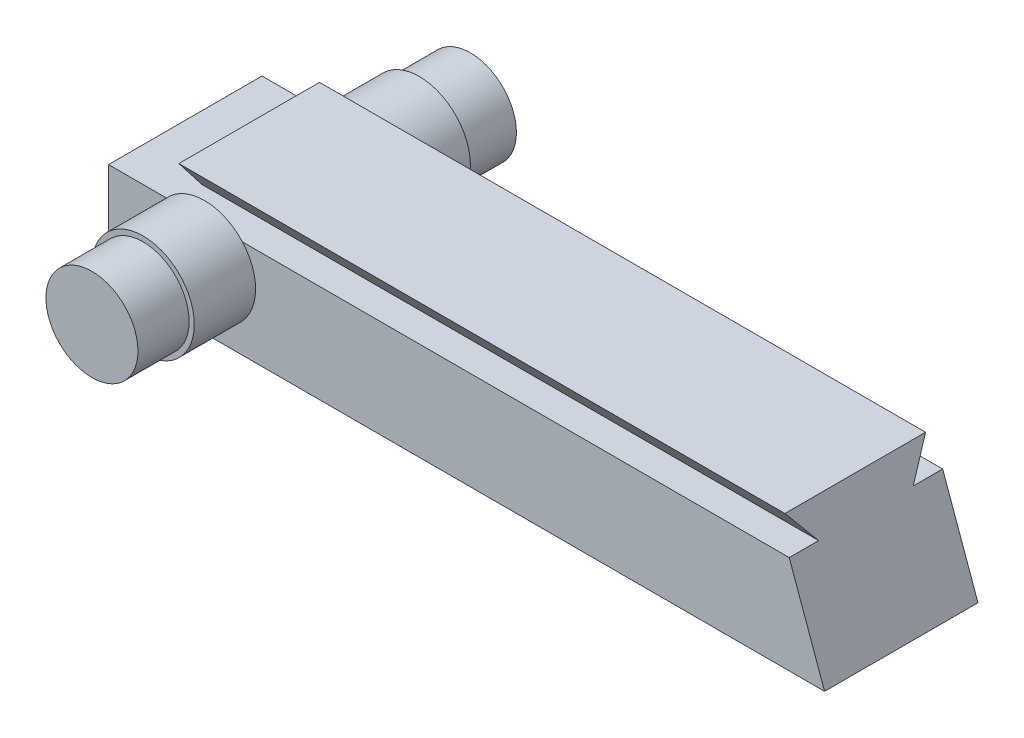
ISO-10303-21;
HEADER;
FILE_DESCRIPTION(('STEP AP214'),'2;1');
FILE_NAME('part.step','',(''),(''),'','','');
FILE_SCHEMA(('AUTOMOTIVE_DESIGN { 1 0 10303 214 1 1 1 1 }'));
ENDSEC;
DATA;
#1=APPLICATION_CONTEXT('core data for automotive mechanical design processes');
#2=APPLICATION_PROTOCOL_DEFINITION('international standard','automotive_design',2000,#1);
#3=PRODUCT_CONTEXT('',#1,'mechanical');
#4=PRODUCT('Part','Part','',(#3));
#5=PRODUCT_RELATED_PRODUCT_CATEGORY('part','',(#4));
#6=PRODUCT_DEFINITION_FORMATION('','',#4);
#7=PRODUCT_DEFINITION_CONTEXT('part definition',#1,'design');
#8=PRODUCT_DEFINITION('design','',#6,#7);
#9=PRODUCT_DEFINITION_SHAPE('','',#8);
#10=(LENGTH_UNIT() NAMED_UNIT(*) SI_UNIT(.MILLI.,.METRE.));
#11=(NAMED_UNIT(*) PLANE_ANGLE_UNIT() SI_UNIT($,.RADIAN.));
#12=(NAMED_UNIT(*) SI_UNIT($,.STERADIAN.) SOLID_ANGLE_UNIT());
#13=UNCERTAINTY_MEASURE_WITH_UNIT(LENGTH_MEASURE(1.E-05),#10,'distance_accuracy_value','');
#14=(GEOMETRIC_REPRESENTATION_CONTEXT(3) GLOBAL_UNCERTAINTY_ASSIGNED_CONTEXT((#13)) GLOBAL_UNIT_ASSIGNED_CONTEXT((#10,
#11,#12)) REPRESENTATION_CONTEXT('',''));
#15=CARTESIAN_POINT('',(0.,0.,0.));
#16=DIRECTION('',(0.,0.,1.));
#17=DIRECTION('',(1.,0.,0.));
#18=AXIS2_PLACEMENT_3D('',#15,#16,#17);
#19=CARTESIAN_POINT('',(-13.0175,0.7366,6.85800000000001));
#20=DIRECTION('',(0.,0.,1.));
#21=DIRECTION('',(1.,0.,0.));
#22=AXIS2_PLACEMENT_3D('',#19,#20,#21);
#23=PLANE('',#22);
#24=CARTESIAN_POINT('',(-13.0175,0.7366,6.85800000000001));
#25=DIRECTION('',(0.,0.,1.));
#26=DIRECTION('',(1.,0.,0.));
#27=AXIS2_PLACEMENT_3D('',#24,#25,#26);
#28=CIRCLE('',#27,2.54);
#29=CARTESIAN_POINT('',(-10.4775,0.7366,6.85800000000001));
#30=VERTEX_POINT('',#29);
#31=EDGE_CURVE('E208',#30,#30,#28,.T.);
#32=ORIENTED_EDGE('',*,*,#31,.T.);
#33=EDGE_LOOP('',(#32));
#34=FACE_BOUND('',#33,.T.);
#35=CARTESIAN_POINT('',(-13.0175,0.7366,6.85800000000001));
#36=DIRECTION('',(0.,0.,1.));
#37=DIRECTION('',(1.,0.,0.));
#38=AXIS2_PLACEMENT_3D('',#35,#36,#37);
#39=CIRCLE('',#38,2.286);
#40=CARTESIAN_POINT('',(-10.7315,0.7366,6.85800000000001));
#41=VERTEX_POINT('',#40);
#42=EDGE_CURVE('E217',#41,#41,#39,.T.);
#43=ORIENTED_EDGE('',*,*,#42,.F.);
#44=EDGE_LOOP('',(#43));
#45=FACE_BOUND('',#44,.T.);
#46=ADVANCED_FACE('F31',(#34,#45),#23,.T.);
#47=CARTESIAN_POINT('',(17.78,-2.4384,3.81000000000001));
#48=DIRECTION('',(0.,0.,-1.));
#49=DIRECTION('',(-1.,0.,0.));
#50=AXIS2_PLACEMENT_3D('',#47,#48,#49);
#51=PLANE('',#50);
#52=CARTESIAN_POINT('',(-13.0175,0.7366,3.81000000000001));
#53=DIRECTION('',(0.,0.,1.));
#54=DIRECTION('',(1.,0.,0.));
#55=AXIS2_PLACEMENT_3D('',#52,#53,#54);
#56=CIRCLE('',#55,2.54);
#57=CARTESIAN_POINT('',(-14.9030971892215,2.4384,3.81000000000001));
#58=VERTEX_POINT('',#57);
#59=CARTESIAN_POINT('',(-11.1319028107785,2.4384,3.81000000000001));
#60=VERTEX_POINT('',#59);
#61=EDGE_CURVE('E53',#58,#60,#56,.T.);
#62=ORIENTED_EDGE('',*,*,#61,.F.);
#63=DIRECTION('',(-1.,0.,0.));
#64=VECTOR('',#63,1.);
#65=CARTESIAN_POINT('',(17.78,2.4384,3.81000000000001));
#66=LINE('',#65,#64);
#67=CARTESIAN_POINT('',(-17.78,2.4384,3.81000000000001));
#68=VERTEX_POINT('',#67);
#69=EDGE_CURVE('E157',#58,#68,#66,.T.);
#70=ORIENTED_EDGE('',*,*,#69,.T.);
#71=DIRECTION('',(0.,-1.,0.));
#72=VECTOR('',#71,1.);
#73=CARTESIAN_POINT('',(-17.78,-2.4384,3.81000000000001));
#74=LINE('',#73,#72);
#75=CARTESIAN_POINT('',(-17.78,-2.4384,3.81000000000001));
#76=VERTEX_POINT('',#75);
#77=EDGE_CURVE('E151',#68,#76,#74,.T.);
#78=ORIENTED_EDGE('',*,*,#77,.T.);
#79=DIRECTION('',(-1.,0.,0.));
#80=VECTOR('',#79,1.);
#81=CARTESIAN_POINT('',(17.78,-2.4384,3.81000000000001));
#82=LINE('',#81,#80);
#83=CARTESIAN_POINT('',(17.78,-2.4384,3.81000000000001));
#84=VERTEX_POINT('',#83);
#85=EDGE_CURVE('E155',#84,#76,#82,.T.);
#86=ORIENTED_EDGE('',*,*,#85,.F.);
#87=DIRECTION('',(0.338719468272742,-0.940887411868727,0.));
#88=VECTOR('',#87,1.);
#89=CARTESIAN_POINT('',(17.78,-2.4384,3.81000000000001));
#90=LINE('',#89,#88);
#91=CARTESIAN_POINT('',(16.024352,2.4384,3.81000000000001));
#92=VERTEX_POINT('',#91);
#93=EDGE_CURVE('E206',#92,#84,#90,.T.);
#94=ORIENTED_EDGE('',*,*,#93,.F.);
#95=EDGE_CURVE('E126',#92,#60,#66,.T.);
#96=ORIENTED_EDGE('',*,*,#95,.T.);
#97=EDGE_LOOP('',(#62,#70,#78,#86,#94,#96));
#98=FACE_BOUND('',#97,.T.);
#99=ADVANCED_FACE('F238',(#98),#51,.F.);
#100=CARTESIAN_POINT('',(17.78,2.4384,3.81000000000001));
#101=DIRECTION('',(0.,-1.,0.));
#102=DIRECTION('',(0.,0.,-1.));
#103=AXIS2_PLACEMENT_3D('',#100,#101,#102);
#104=PLANE('',#103);
#105=ORIENTED_EDGE('',*,*,#95,.F.);
#106=DIRECTION('',(0.,0.,-1.));
#107=VECTOR('',#106,1.);
#108=CARTESIAN_POINT('',(16.024352,2.4384,3.81000000000001));
#109=LINE('',#108,#107);
#110=CARTESIAN_POINT('',(16.024352,2.4384,2.3495));
#111=VERTEX_POINT('',#110);
#112=EDGE_CURVE('E185',#92,#111,#109,.T.);
#113=ORIENTED_EDGE('',*,*,#112,.T.);
#114=DIRECTION('',(1.,0.,0.));
#115=VECTOR('',#114,1.);
#116=CARTESIAN_POINT('',(-14.605,2.4384,2.3495));
#117=LINE('',#116,#115);
#118=CARTESIAN_POINT('',(-14.605,2.4384,2.3495));
#119=VERTEX_POINT('',#118);
#120=EDGE_CURVE('E141',#119,#111,#117,.T.);
#121=ORIENTED_EDGE('',*,*,#120,.F.);
#122=DIRECTION('',(0.,0.,-1.));
#123=VECTOR('',#122,1.);
#124=CARTESIAN_POINT('',(-14.605,2.4384,2.3495));
#125=LINE('',#124,#123);
#126=CARTESIAN_POINT('',(-14.605,2.4384,-2.3495));
#127=VERTEX_POINT('',#126);
#128=EDGE_CURVE('E184',#119,#127,#125,.T.);
#129=ORIENTED_EDGE('',*,*,#128,.T.);
#130=DIRECTION('',(1.,0.,0.));
#131=VECTOR('',#130,1.);
#132=CARTESIAN_POINT('',(-14.605,2.4384,-2.3495));
#133=LINE('',#132,#131);
#134=CARTESIAN_POINT('',(16.024352,2.4384,-2.3495));
#135=VERTEX_POINT('',#134);
#136=EDGE_CURVE('E136',#127,#135,#133,.T.);
#137=ORIENTED_EDGE('',*,*,#136,.T.);
#138=CARTESIAN_POINT('',(16.024352,2.4384,-3.80999999999999));
#139=VERTEX_POINT('',#138);
#140=EDGE_CURVE('E179',#135,#139,#109,.T.);
#141=ORIENTED_EDGE('',*,*,#140,.T.);
#142=DIRECTION('',(-1.,0.,0.));
#143=VECTOR('',#142,1.);
#144=CARTESIAN_POINT('',(17.78,2.4384,-3.80999999999999));
#145=LINE('',#144,#143);
#146=CARTESIAN_POINT('',(-11.1319028107785,2.4384,-3.81000000000001));
#147=VERTEX_POINT('',#146);
#148=EDGE_CURVE('E128',#139,#147,#145,.T.);
#149=ORIENTED_EDGE('',*,*,#148,.T.);
#150=CARTESIAN_POINT('',(-14.9030971892215,2.4384,-3.81000000000001));
#151=VERTEX_POINT('',#150);
#152=EDGE_CURVE('E115',#147,#151,#145,.T.);
#153=ORIENTED_EDGE('',*,*,#152,.T.);
#154=CARTESIAN_POINT('',(-17.78,2.4384,-3.80999999999999));
#155=VERTEX_POINT('',#154);
#156=EDGE_CURVE('E119',#151,#155,#145,.T.);
#157=ORIENTED_EDGE('',*,*,#156,.T.);
#158=DIRECTION('',(0.,0.,1.));
#159=VECTOR('',#158,1.);
#160=CARTESIAN_POINT('',(-17.78,2.4384,3.81000000000001));
#161=LINE('',#160,#159);
#162=EDGE_CURVE('E148',#155,#68,#161,.T.);
#163=ORIENTED_EDGE('',*,*,#162,.T.);
#164=ORIENTED_EDGE('',*,*,#69,.F.);
#165=EDGE_CURVE('E163',#60,#58,#66,.T.);
#166=ORIENTED_EDGE('',*,*,#165,.F.);
#167=EDGE_LOOP('',(#105,#113,#121,#129,#137,#141,#149,#153,#157,#163,#164,#166));
#168=FACE_BOUND('',#167,.T.);
#169=ADVANCED_FACE('F130',(#168),#104,.F.);
#170=CARTESIAN_POINT('',(17.78,-2.4384,-3.80999999999999));
#171=DIRECTION('',(0.,0.,1.));
#172=DIRECTION('',(1.,0.,0.));
#173=AXIS2_PLACEMENT_3D('',#170,#171,#172);
#174=PLANE('',#173);
#175=ORIENTED_EDGE('',*,*,#156,.F.);
#176=CARTESIAN_POINT('',(-13.0175,0.7366,-3.81000000000001));
#177=DIRECTION('',(0.,0.,1.));
#178=DIRECTION('',(1.,0.,0.));
#179=AXIS2_PLACEMENT_3D('',#176,#177,#178);
#180=CIRCLE('',#179,2.54);
#181=EDGE_CURVE('E39',#151,#147,#180,.T.);
#182=ORIENTED_EDGE('',*,*,#181,.T.);
#183=ORIENTED_EDGE('',*,*,#148,.F.);
#184=DIRECTION('',(0.338719468272742,-0.940887411868727,0.));
#185=VECTOR('',#184,1.);
#186=CARTESIAN_POINT('',(17.78,-2.4384,-3.80999999999999));
#187=LINE('',#186,#185);
#188=CARTESIAN_POINT('',(17.78,-2.4384,-3.81000249999999));
#189=VERTEX_POINT('',#188);
#190=EDGE_CURVE('E175',#139,#189,#187,.T.);
#191=ORIENTED_EDGE('',*,*,#190,.T.);
#192=DIRECTION('',(-1.,0.,0.));
#193=VECTOR('',#192,1.);
#194=CARTESIAN_POINT('',(17.78,-2.4384,-3.80999999999999));
#195=LINE('',#194,#193);
#196=CARTESIAN_POINT('',(-17.78,-2.4384,-3.80999999999999));
#197=VERTEX_POINT('',#196);
#198=EDGE_CURVE('E158',#189,#197,#195,.T.);
#199=ORIENTED_EDGE('',*,*,#198,.T.);
#200=DIRECTION('',(0.,1.,0.));
#201=VECTOR('',#200,1.);
#202=CARTESIAN_POINT('',(-17.78,-2.4384,-3.80999999999999));
#203=LINE('',#202,#201);
#204=EDGE_CURVE('E122',#197,#155,#203,.T.);
#205=ORIENTED_EDGE('',*,*,#204,.T.);
#206=EDGE_LOOP('',(#175,#182,#183,#191,#199,#205));
#207=FACE_BOUND('',#206,.T.);
#208=ADVANCED_FACE('F33',(#207),#174,.F.);
#209=CARTESIAN_POINT('',(17.78,-2.4384,3.81000000000001));
#210=DIRECTION('',(0.,1.,0.));
#211=DIRECTION('',(0.,0.,1.));
#212=AXIS2_PLACEMENT_3D('',#209,#210,#211);
#213=PLANE('',#212);
#214=DIRECTION('',(0.,0.,-1.));
#215=VECTOR('',#214,1.);
#216=CARTESIAN_POINT('',(-17.78,-2.4384,3.81000000000001));
#217=LINE('',#216,#215);
#218=EDGE_CURVE('E153',#76,#197,#217,.T.);
#219=ORIENTED_EDGE('',*,*,#218,.T.);
#220=ORIENTED_EDGE('',*,*,#198,.F.);
#221=DIRECTION('',(0.,0.,-1.));
#222=VECTOR('',#221,1.);
#223=CARTESIAN_POINT('',(17.78,-2.4384,3.81000000000001));
#224=LINE('',#223,#222);
#225=EDGE_CURVE('E154',#84,#189,#224,.T.);
#226=ORIENTED_EDGE('',*,*,#225,.F.);
#227=ORIENTED_EDGE('',*,*,#85,.T.);
#228=EDGE_LOOP('',(#219,#220,#226,#227));
#229=FACE_BOUND('',#228,.T.);
#230=ADVANCED_FACE('F276',(#229),#213,.F.);
#231=CARTESIAN_POINT('',(-17.78,2.4384,-3.80999999999999));
#232=DIRECTION('',(-1.,0.,0.));
#233=DIRECTION('',(0.,0.,1.));
#234=AXIS2_PLACEMENT_3D('',#231,#232,#233);
#235=PLANE('',#234);
#236=ORIENTED_EDGE('',*,*,#204,.F.);
#237=ORIENTED_EDGE('',*,*,#218,.F.);
#238=ORIENTED_EDGE('',*,*,#77,.F.);
#239=ORIENTED_EDGE('',*,*,#162,.F.);
#240=EDGE_LOOP('',(#236,#237,#238,#239));
#241=FACE_BOUND('',#240,.T.);
#242=ADVANCED_FACE('F272',(#241),#235,.T.);
#243=CARTESIAN_POINT('',(-14.605,3.9116,3.4925));
#244=DIRECTION('',(0.,-0.612997102876588,0.790085154818713));
#245=DIRECTION('',(0.,-0.790085154818713,-0.612997102876588));
#246=AXIS2_PLACEMENT_3D('',#243,#244,#245);
#247=PLANE('',#246);
#248=DIRECTION('',(0.273579457367753,-0.759942937132647,-0.589610899499468));
#249=VECTOR('',#248,1.);
#250=CARTESIAN_POINT('',(13.2412186889611,10.1693258639969,8.34763213585969));
#251=LINE('',#250,#249);
#252=CARTESIAN_POINT('',(15.494,3.9116,3.4925));
#253=VERTEX_POINT('',#252);
#254=EDGE_CURVE('E178',#253,#111,#251,.T.);
#255=ORIENTED_EDGE('',*,*,#254,.F.);
#256=DIRECTION('',(1.,0.,0.));
#257=VECTOR('',#256,1.);
#258=CARTESIAN_POINT('',(-14.605,3.9116,3.4925));
#259=LINE('',#258,#257);
#260=CARTESIAN_POINT('',(-14.605,3.9116,3.4925));
#261=VERTEX_POINT('',#260);
#262=EDGE_CURVE('E149',#261,#253,#259,.T.);
#263=ORIENTED_EDGE('',*,*,#262,.F.);
#264=DIRECTION('',(0.,-0.790085154818713,-0.612997102876588));
#265=VECTOR('',#264,1.);
#266=CARTESIAN_POINT('',(-14.605,3.9116,3.4925));
#267=LINE('',#266,#265);
#268=EDGE_CURVE('E181',#261,#119,#267,.T.);
#269=ORIENTED_EDGE('',*,*,#268,.T.);
#270=ORIENTED_EDGE('',*,*,#120,.T.);
#271=EDGE_LOOP('',(#255,#263,#269,#270));
#272=FACE_BOUND('',#271,.T.);
#273=ADVANCED_FACE('F267',(#272),#247,.T.);
#274=CARTESIAN_POINT('',(-14.605,3.9116,3.4925));
#275=DIRECTION('',(0.,1.,0.));
#276=DIRECTION('',(0.,0.,1.));
#277=AXIS2_PLACEMENT_3D('',#274,#275,#276);
#278=PLANE('',#277);
#279=DIRECTION('',(0.,0.,1.));
#280=VECTOR('',#279,1.);
#281=CARTESIAN_POINT('',(15.494,3.9116,-3.81002499999999));
#282=LINE('',#281,#280);
#283=CARTESIAN_POINT('',(15.494,3.9116,-3.4925));
#284=VERTEX_POINT('',#283);
#285=EDGE_CURVE('E203',#284,#253,#282,.T.);
#286=ORIENTED_EDGE('',*,*,#285,.F.);
#287=DIRECTION('',(1.,0.,0.));
#288=VECTOR('',#287,1.);
#289=CARTESIAN_POINT('',(-14.605,3.9116,-3.4925));
#290=LINE('',#289,#288);
#291=CARTESIAN_POINT('',(-14.605,3.9116,-3.4925));
#292=VERTEX_POINT('',#291);
#293=EDGE_CURVE('E140',#292,#284,#290,.T.);
#294=ORIENTED_EDGE('',*,*,#293,.F.);
#295=DIRECTION('',(0.,0.,1.));
#296=VECTOR('',#295,1.);
#297=CARTESIAN_POINT('',(-14.605,3.9116,3.4925));
#298=LINE('',#297,#296);
#299=EDGE_CURVE('E191',#292,#261,#298,.T.);
#300=ORIENTED_EDGE('',*,*,#299,.T.);
#301=ORIENTED_EDGE('',*,*,#262,.T.);
#302=EDGE_LOOP('',(#286,#294,#300,#301));
#303=FACE_BOUND('',#302,.T.);
#304=ADVANCED_FACE('F202',(#303),#278,.T.);
#305=CARTESIAN_POINT('',(-14.605,3.9116,-3.4925));
#306=DIRECTION('',(0.,-0.612997102876588,-0.790085154818713));
#307=DIRECTION('',(0.,0.790085154818713,-0.612997102876588));
#308=AXIS2_PLACEMENT_3D('',#305,#306,#307);
#309=PLANE('',#308);
#310=DIRECTION('',(-0.273579457367753,0.759942937132647,-0.589610899499468));
#311=VECTOR('',#310,1.);
#312=CARTESIAN_POINT('',(13.2412186889611,10.1693258639969,-8.34763213585969));
#313=LINE('',#312,#311);
#314=EDGE_CURVE('E132',#135,#284,#313,.T.);
#315=ORIENTED_EDGE('',*,*,#314,.F.);
#316=ORIENTED_EDGE('',*,*,#136,.F.);
#317=DIRECTION('',(0.,0.790085154818713,-0.612997102876588));
#318=VECTOR('',#317,1.);
#319=CARTESIAN_POINT('',(-14.605,3.9116,-3.4925));
#320=LINE('',#319,#318);
#321=EDGE_CURVE('E188',#127,#292,#320,.T.);
#322=ORIENTED_EDGE('',*,*,#321,.T.);
#323=ORIENTED_EDGE('',*,*,#293,.T.);
#324=EDGE_LOOP('',(#315,#316,#322,#323));
#325=FACE_BOUND('',#324,.T.);
#326=ADVANCED_FACE('F199',(#325),#309,.T.);
#327=CARTESIAN_POINT('',(-14.605,-0.589844444444443,0.));
#328=DIRECTION('',(-1.,0.,0.));
#329=DIRECTION('',(0.,0.,1.));
#330=AXIS2_PLACEMENT_3D('',#327,#328,#329);
#331=PLANE('',#330);
#332=ORIENTED_EDGE('',*,*,#268,.F.);
#333=ORIENTED_EDGE('',*,*,#299,.F.);
#334=ORIENTED_EDGE('',*,*,#321,.F.);
#335=ORIENTED_EDGE('',*,*,#128,.F.);
#336=EDGE_LOOP('',(#332,#333,#334,#335));
#337=FACE_BOUND('',#336,.T.);
#338=ADVANCED_FACE('F261',(#337),#331,.T.);
#339=CARTESIAN_POINT('',(17.78,-2.4384,-3.81002499999999));
#340=DIRECTION('',(-0.940887411868727,-0.338719468272742,0.));
#341=DIRECTION('',(0.338719468272742,-0.940887411868727,0.));
#342=AXIS2_PLACEMENT_3D('',#339,#340,#341);
#343=PLANE('',#342);
#344=ORIENTED_EDGE('',*,*,#93,.T.);
#345=ORIENTED_EDGE('',*,*,#225,.T.);
#346=ORIENTED_EDGE('',*,*,#190,.F.);
#347=ORIENTED_EDGE('',*,*,#140,.F.);
#348=ORIENTED_EDGE('',*,*,#314,.T.);
#349=ORIENTED_EDGE('',*,*,#285,.T.);
#350=ORIENTED_EDGE('',*,*,#254,.T.);
#351=ORIENTED_EDGE('',*,*,#112,.F.);
#352=EDGE_LOOP('',(#344,#345,#346,#347,#348,#349,#350,#351));
#353=FACE_BOUND('',#352,.T.);
#354=ADVANCED_FACE('F254',(#353),#343,.F.);
#355=CARTESIAN_POINT('',(-13.0175,0.7366,3.81000000000001));
#356=DIRECTION('',(0.,0.,1.));
#357=DIRECTION('',(1.,0.,0.));
#358=AXIS2_PLACEMENT_3D('',#355,#356,#357);
#359=PLANE('',#358);
#360=EDGE_CURVE('E211',#60,#58,#56,.T.);
#361=ORIENTED_EDGE('',*,*,#360,.F.);
#362=ORIENTED_EDGE('',*,*,#165,.T.);
#363=EDGE_LOOP('',(#361,#362));
#364=FACE_BOUND('',#363,.T.);
#365=ADVANCED_FACE('F250',(#364),#359,.F.);
#366=CARTESIAN_POINT('',(-13.0175,0.7366,6.85800000000001));
#367=DIRECTION('',(0.,0.,-1.));
#368=DIRECTION('',(-1.,0.,0.));
#369=AXIS2_PLACEMENT_3D('',#366,#367,#368);
#370=CYLINDRICAL_SURFACE('',#369,2.54);
#371=ORIENTED_EDGE('',*,*,#31,.F.);
#372=EDGE_LOOP('',(#371));
#373=FACE_BOUND('',#372,.T.);
#374=ORIENTED_EDGE('',*,*,#360,.T.);
#375=ORIENTED_EDGE('',*,*,#61,.T.);
#376=EDGE_LOOP('',(#374,#375));
#377=FACE_BOUND('',#376,.T.);
#378=ADVANCED_FACE('F253',(#373,#377),#370,.T.);
#379=CARTESIAN_POINT('',(-13.0175,0.7366,9.39800000000001));
#380=DIRECTION('',(0.,0.,-1.));
#381=DIRECTION('',(-1.,0.,0.));
#382=AXIS2_PLACEMENT_3D('',#379,#380,#381);
#383=CYLINDRICAL_SURFACE('',#382,2.286);
#384=CARTESIAN_POINT('',(-13.0175,0.7366,9.39800000000001));
#385=DIRECTION('',(0.,0.,1.));
#386=DIRECTION('',(1.,0.,0.));
#387=AXIS2_PLACEMENT_3D('',#384,#385,#386);
#388=CIRCLE('',#387,2.286);
#389=CARTESIAN_POINT('',(-10.7315,0.7366,9.39800000000001));
#390=VERTEX_POINT('',#389);
#391=EDGE_CURVE('E214',#390,#390,#388,.T.);
#392=ORIENTED_EDGE('',*,*,#391,.F.);
#393=EDGE_LOOP('',(#392));
#394=FACE_BOUND('',#393,.T.);
#395=ORIENTED_EDGE('',*,*,#42,.T.);
#396=EDGE_LOOP('',(#395));
#397=FACE_BOUND('',#396,.T.);
#398=ADVANCED_FACE('F248',(#394,#397),#383,.T.);
#399=CARTESIAN_POINT('',(-13.0175,0.7366,9.39800000000001));
#400=DIRECTION('',(0.,0.,1.));
#401=DIRECTION('',(1.,0.,0.));
#402=AXIS2_PLACEMENT_3D('',#399,#400,#401);
#403=PLANE('',#402);
#404=ORIENTED_EDGE('',*,*,#391,.T.);
#405=EDGE_LOOP('',(#404));
#406=FACE_BOUND('',#405,.T.);
#407=ADVANCED_FACE('F329',(#406),#403,.T.);
#408=CARTESIAN_POINT('',(-13.0175,0.7366,-6.85800000000001));
#409=DIRECTION('',(0.,0.,1.));
#410=DIRECTION('',(1.,0.,0.));
#411=AXIS2_PLACEMENT_3D('',#408,#409,#410);
#412=CYLINDRICAL_SURFACE('',#411,2.54);
#413=CARTESIAN_POINT('',(-13.0175,0.7366,-6.85800000000001));
#414=DIRECTION('',(0.,0.,1.));
#415=DIRECTION('',(1.,0.,0.));
#416=AXIS2_PLACEMENT_3D('',#413,#414,#415);
#417=CIRCLE('',#416,2.54);
#418=CARTESIAN_POINT('',(-10.4775,0.7366,-6.85800000000001));
#419=VERTEX_POINT('',#418);
#420=EDGE_CURVE('E116',#419,#419,#417,.T.);
#421=ORIENTED_EDGE('',*,*,#420,.T.);
#422=EDGE_LOOP('',(#421));
#423=FACE_BOUND('',#422,.T.);
#424=EDGE_CURVE('E45',#147,#151,#180,.T.);
#425=ORIENTED_EDGE('',*,*,#424,.F.);
#426=ORIENTED_EDGE('',*,*,#181,.F.);
#427=EDGE_LOOP('',(#425,#426));
#428=FACE_BOUND('',#427,.T.);
#429=ADVANCED_FACE('F106',(#423,#428),#412,.T.);
#430=CARTESIAN_POINT('',(-13.0175,0.7366,-6.85800000000001));
#431=DIRECTION('',(0.,0.,-1.));
#432=DIRECTION('',(1.,0.,0.));
#433=AXIS2_PLACEMENT_3D('',#430,#431,#432);
#434=PLANE('',#433);
#435=CARTESIAN_POINT('',(-13.0175,0.7366,-6.85800000000001));
#436=DIRECTION('',(0.,0.,-1.));
#437=DIRECTION('',(-1.,0.,0.));
#438=AXIS2_PLACEMENT_3D('',#435,#436,#437);
#439=CIRCLE('',#438,2.286);
#440=CARTESIAN_POINT('',(-15.3035,0.7366,-6.85800000000001));
#441=VERTEX_POINT('',#440);
#442=EDGE_CURVE('E11',#441,#441,#439,.T.);
#443=ORIENTED_EDGE('',*,*,#442,.F.);
#444=EDGE_LOOP('',(#443));
#445=FACE_BOUND('',#444,.T.);
#446=ORIENTED_EDGE('',*,*,#420,.F.);
#447=EDGE_LOOP('',(#446));
#448=FACE_BOUND('',#447,.T.);
#449=ADVANCED_FACE('F341',(#445,#448),#434,.T.);
#450=CARTESIAN_POINT('',(-13.0175,0.7366,-3.81000000000001));
#451=DIRECTION('',(0.,0.,-1.));
#452=DIRECTION('',(1.,0.,0.));
#453=AXIS2_PLACEMENT_3D('',#450,#451,#452);
#454=PLANE('',#453);
#455=ORIENTED_EDGE('',*,*,#152,.F.);
#456=ORIENTED_EDGE('',*,*,#424,.T.);
#457=EDGE_LOOP('',(#455,#456));
#458=FACE_BOUND('',#457,.T.);
#459=ADVANCED_FACE('F113',(#458),#454,.F.);
#460=CARTESIAN_POINT('',(-13.0175,0.7366,-9.39800000000001));
#461=DIRECTION('',(0.,0.,1.));
#462=DIRECTION('',(1.,0.,0.));
#463=AXIS2_PLACEMENT_3D('',#460,#461,#462);
#464=CYLINDRICAL_SURFACE('',#463,2.286);
#465=CARTESIAN_POINT('',(-13.0175,0.7366,-9.39800000000001));
#466=DIRECTION('',(0.,0.,1.));
#467=DIRECTION('',(1.,0.,0.));
#468=AXIS2_PLACEMENT_3D('',#465,#466,#467);
#469=CIRCLE('',#468,2.286);
#470=CARTESIAN_POINT('',(-10.7315,0.7366,-9.39800000000001));
#471=VERTEX_POINT('',#470);
#472=EDGE_CURVE('E117',#471,#471,#469,.T.);
#473=ORIENTED_EDGE('',*,*,#472,.T.);
#474=EDGE_LOOP('',(#473));
#475=FACE_BOUND('',#474,.T.);
#476=ORIENTED_EDGE('',*,*,#442,.T.);
#477=EDGE_LOOP('',(#476));
#478=FACE_BOUND('',#477,.T.);
#479=ADVANCED_FACE('F227',(#475,#478),#464,.T.);
#480=CARTESIAN_POINT('',(-13.0175,0.7366,-9.39800000000001));
#481=DIRECTION('',(0.,0.,-1.));
#482=DIRECTION('',(1.,0.,0.));
#483=AXIS2_PLACEMENT_3D('',#480,#481,#482);
#484=PLANE('',#483);
#485=ORIENTED_EDGE('',*,*,#472,.F.);
#486=EDGE_LOOP('',(#485));
#487=FACE_BOUND('',#486,.T.);
#488=ADVANCED_FACE('F230',(#487),#484,.T.);
#489=CLOSED_SHELL('',(#46,#99,#169,#208,#230,#242,#273,#304,#326,#338,#354,#365,#378,#398,#407,
#429,#449,#459,#479,#488));
#490=MANIFOLD_SOLID_BREP('B2',#489);
#491=ADVANCED_BREP_SHAPE_REPRESENTATION('',(#18,#490),#14);
#492=SHAPE_DEFINITION_REPRESENTATION(#9,#491);
ENDSEC;
END-ISO-10303-21;
